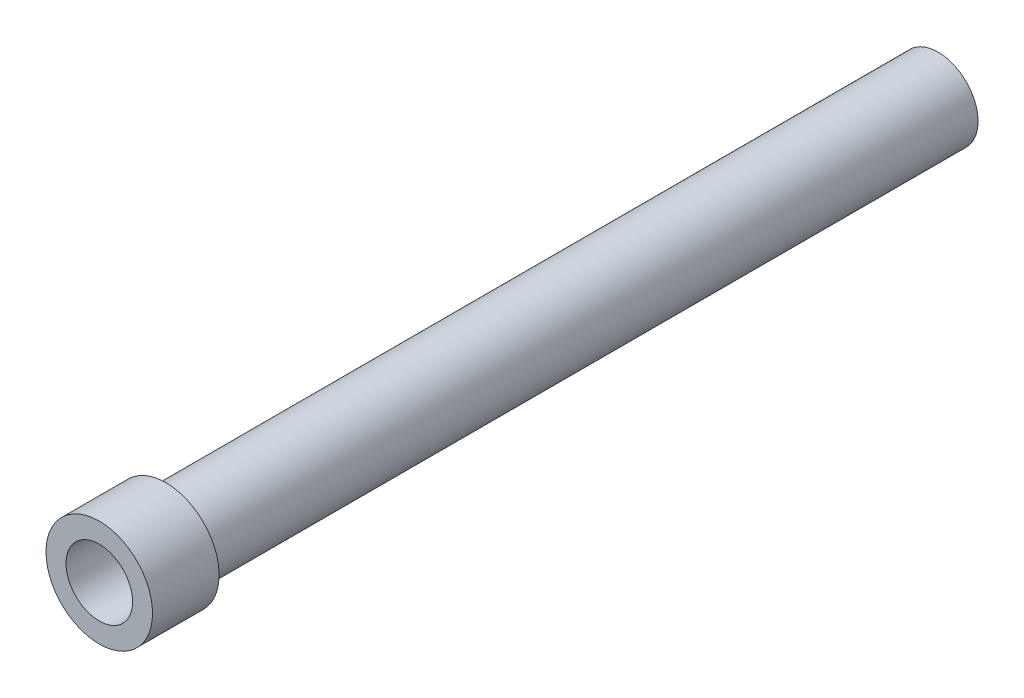
ISO-10303-21;
HEADER;
FILE_DESCRIPTION(('STEP AP214'),'2;1');
FILE_NAME('part.step','',(''),(''),'','','');
FILE_SCHEMA(('AUTOMOTIVE_DESIGN { 1 0 10303 214 1 1 1 1 }'));
ENDSEC;
DATA;
#1=APPLICATION_CONTEXT('core data for automotive mechanical design processes');
#2=APPLICATION_PROTOCOL_DEFINITION('international standard','automotive_design',2000,#1);
#3=PRODUCT_CONTEXT('',#1,'mechanical');
#4=PRODUCT('Part','Part','',(#3));
#5=PRODUCT_RELATED_PRODUCT_CATEGORY('part','',(#4));
#6=PRODUCT_DEFINITION_FORMATION('','',#4);
#7=PRODUCT_DEFINITION_CONTEXT('part definition',#1,'design');
#8=PRODUCT_DEFINITION('design','',#6,#7);
#9=PRODUCT_DEFINITION_SHAPE('','',#8);
#10=(LENGTH_UNIT() NAMED_UNIT(*) SI_UNIT(.MILLI.,.METRE.));
#11=(NAMED_UNIT(*) PLANE_ANGLE_UNIT() SI_UNIT($,.RADIAN.));
#12=(NAMED_UNIT(*) SI_UNIT($,.STERADIAN.) SOLID_ANGLE_UNIT());
#13=UNCERTAINTY_MEASURE_WITH_UNIT(LENGTH_MEASURE(1.E-05),#10,'distance_accuracy_value','');
#14=(GEOMETRIC_REPRESENTATION_CONTEXT(3) GLOBAL_UNCERTAINTY_ASSIGNED_CONTEXT((#13)) GLOBAL_UNIT_ASSIGNED_CONTEXT((#10,
#11,#12)) REPRESENTATION_CONTEXT('',''));
#15=CARTESIAN_POINT('',(0.,0.,0.));
#16=DIRECTION('',(0.,0.,1.));
#17=DIRECTION('',(1.,0.,0.));
#18=AXIS2_PLACEMENT_3D('',#15,#16,#17);
#19=CARTESIAN_POINT('',(-21.2024389130223,3.95852329038651,63.));
#20=DIRECTION('',(0.,0.,-1.));
#21=DIRECTION('',(-1.,0.,0.));
#22=AXIS2_PLACEMENT_3D('',#19,#20,#21);
#23=CYLINDRICAL_SURFACE('',#22,4.);
#24=CARTESIAN_POINT('',(-21.2024389130223,3.95852329038651,63.));
#25=DIRECTION('',(0.,0.,1.));
#26=DIRECTION('',(1.,0.,0.));
#27=AXIS2_PLACEMENT_3D('',#24,#25,#26);
#28=CIRCLE('',#27,4.);
#29=CARTESIAN_POINT('',(-17.2024389130223,3.95852329038651,63.));
#30=VERTEX_POINT('',#29);
#31=EDGE_CURVE('E10',#30,#30,#28,.T.);
#32=ORIENTED_EDGE('',*,*,#31,.F.);
#33=EDGE_LOOP('',(#32));
#34=FACE_BOUND('',#33,.T.);
#35=CARTESIAN_POINT('',(-21.2024389130223,3.95852329038651,58.));
#36=DIRECTION('',(0.,0.,-1.));
#37=DIRECTION('',(-1.,0.,0.));
#38=AXIS2_PLACEMENT_3D('',#35,#36,#37);
#39=CIRCLE('',#38,4.);
#40=CARTESIAN_POINT('',(-25.2024389130223,3.95852329038651,58.));
#41=VERTEX_POINT('',#40);
#42=EDGE_CURVE('E35',#41,#41,#39,.T.);
#43=ORIENTED_EDGE('',*,*,#42,.F.);
#44=EDGE_LOOP('',(#43));
#45=FACE_BOUND('',#44,.T.);
#46=ADVANCED_FACE('F32',(#34,#45),#23,.T.);
#47=CARTESIAN_POINT('',(-21.2024389130223,3.95852329038651,63.));
#48=DIRECTION('',(0.,0.,1.));
#49=DIRECTION('',(1.,0.,0.));
#50=AXIS2_PLACEMENT_3D('',#47,#48,#49);
#51=PLANE('',#50);
#52=CARTESIAN_POINT('',(-21.2024389130223,3.95852329038651,63.));
#53=DIRECTION('',(0.,0.,1.));
#54=DIRECTION('',(1.,0.,0.));
#55=AXIS2_PLACEMENT_3D('',#52,#53,#54);
#56=CIRCLE('',#55,2.5);
#57=CARTESIAN_POINT('',(-18.7024389130223,3.95852329038651,63.));
#58=VERTEX_POINT('',#57);
#59=EDGE_CURVE('E43',#58,#58,#56,.T.);
#60=ORIENTED_EDGE('',*,*,#59,.F.);
#61=EDGE_LOOP('',(#60));
#62=FACE_BOUND('',#61,.T.);
#63=ORIENTED_EDGE('',*,*,#31,.T.);
#64=EDGE_LOOP('',(#63));
#65=FACE_BOUND('',#64,.T.);
#66=ADVANCED_FACE('F61',(#62,#65),#51,.T.);
#67=CARTESIAN_POINT('',(-21.2024389130223,3.95852329038651,36.));
#68=DIRECTION('',(0.,0.,1.));
#69=DIRECTION('',(1.,0.,0.));
#70=AXIS2_PLACEMENT_3D('',#67,#68,#69);
#71=CYLINDRICAL_SURFACE('',#70,2.5);
#72=CARTESIAN_POINT('',(-21.2024389130223,3.95852329038651,36.));
#73=DIRECTION('',(0.,0.,1.));
#74=DIRECTION('',(1.,0.,0.));
#75=AXIS2_PLACEMENT_3D('',#72,#73,#74);
#76=CIRCLE('',#75,2.5);
#77=CARTESIAN_POINT('',(-18.7024389130223,3.95852329038651,36.));
#78=VERTEX_POINT('',#77);
#79=EDGE_CURVE('E39',#78,#78,#76,.T.);
#80=ORIENTED_EDGE('',*,*,#79,.F.);
#81=EDGE_LOOP('',(#80));
#82=FACE_BOUND('',#81,.T.);
#83=ORIENTED_EDGE('',*,*,#59,.T.);
#84=EDGE_LOOP('',(#83));
#85=FACE_BOUND('',#84,.T.);
#86=ADVANCED_FACE('F66',(#82,#85),#71,.F.);
#87=CARTESIAN_POINT('',(-21.2024389130223,3.95852329038651,36.));
#88=DIRECTION('',(0.,0.,1.));
#89=DIRECTION('',(1.,0.,0.));
#90=AXIS2_PLACEMENT_3D('',#87,#88,#89);
#91=PLANE('',#90);
#92=ORIENTED_EDGE('',*,*,#79,.T.);
#93=EDGE_LOOP('',(#92));
#94=FACE_BOUND('',#93,.T.);
#95=ADVANCED_FACE('F72',(#94),#91,.T.);
#96=CARTESIAN_POINT('',(-21.2024389130223,3.95852329038651,58.));
#97=DIRECTION('',(0.,0.,-1.));
#98=DIRECTION('',(-1.,0.,0.));
#99=AXIS2_PLACEMENT_3D('',#96,#97,#98);
#100=PLANE('',#99);
#101=CARTESIAN_POINT('',(-21.2024389130223,3.95852329038651,58.));
#102=DIRECTION('',(0.,0.,-1.));
#103=DIRECTION('',(-1.,0.,0.));
#104=AXIS2_PLACEMENT_3D('',#101,#102,#103);
#105=CIRCLE('',#104,3.);
#106=CARTESIAN_POINT('',(-24.2024389130223,3.95852329038651,58.));
#107=VERTEX_POINT('',#106);
#108=EDGE_CURVE('E51',#107,#107,#105,.T.);
#109=ORIENTED_EDGE('',*,*,#108,.F.);
#110=EDGE_LOOP('',(#109));
#111=FACE_BOUND('',#110,.T.);
#112=ORIENTED_EDGE('',*,*,#42,.T.);
#113=EDGE_LOOP('',(#112));
#114=FACE_BOUND('',#113,.T.);
#115=ADVANCED_FACE('F58',(#111,#114),#100,.T.);
#116=CARTESIAN_POINT('',(-21.2024389130223,3.95852329038651,58.));
#117=DIRECTION('',(0.,0.,-1.));
#118=DIRECTION('',(-1.,0.,0.));
#119=AXIS2_PLACEMENT_3D('',#116,#117,#118);
#120=CYLINDRICAL_SURFACE('',#119,3.);
#121=CARTESIAN_POINT('',(-21.2024389130223,3.95852329038651,0.));
#122=DIRECTION('',(0.,0.,-1.));
#123=DIRECTION('',(-1.,0.,0.));
#124=AXIS2_PLACEMENT_3D('',#121,#122,#123);
#125=CIRCLE('',#124,3.);
#126=CARTESIAN_POINT('',(-24.2024389130223,3.95852329038651,0.));
#127=VERTEX_POINT('',#126);
#128=EDGE_CURVE('E48',#127,#127,#125,.T.);
#129=CARTESIAN_POINT('',(-24.2024389130223,3.95852329038651,58.));
#130=CARTESIAN_POINT('',(-24.2024389130223,3.95852329038651,57.3958333333333));
#131=CARTESIAN_POINT('',(-24.2024389130223,3.95852329038651,56.7916666666667));
#132=CARTESIAN_POINT('',(-24.2024389130223,3.95852329038651,55.5833333333333));
#133=CARTESIAN_POINT('',(-24.2024389130223,3.95852329038651,54.9791666666667));
#134=CARTESIAN_POINT('',(-24.2024389130223,3.95852329038651,53.7708333333333));
#135=CARTESIAN_POINT('',(-24.2024389130223,3.95852329038651,53.1666666666667));
#136=CARTESIAN_POINT('',(-24.2024389130223,3.95852329038651,51.9583333333333));
#137=CARTESIAN_POINT('',(-24.2024389130223,3.95852329038651,51.3541666666667));
#138=CARTESIAN_POINT('',(-24.2024389130223,3.95852329038651,50.1458333333333));
#139=CARTESIAN_POINT('',(-24.2024389130223,3.95852329038651,49.5416666666667));
#140=CARTESIAN_POINT('',(-24.2024389130223,3.95852329038651,48.3333333333333));
#141=CARTESIAN_POINT('',(-24.2024389130223,3.95852329038651,47.7291666666667));
#142=CARTESIAN_POINT('',(-24.2024389130223,3.95852329038651,46.5208333333333));
#143=CARTESIAN_POINT('',(-24.2024389130223,3.95852329038651,45.9166666666667));
#144=CARTESIAN_POINT('',(-24.2024389130223,3.95852329038651,44.7083333333333));
#145=CARTESIAN_POINT('',(-24.2024389130223,3.95852329038651,44.1041666666667));
#146=CARTESIAN_POINT('',(-24.2024389130223,3.95852329038651,42.8958333333333));
#147=CARTESIAN_POINT('',(-24.2024389130223,3.95852329038651,42.2916666666667));
#148=CARTESIAN_POINT('',(-24.2024389130223,3.95852329038651,41.0833333333333));
#149=CARTESIAN_POINT('',(-24.2024389130223,3.95852329038651,40.4791666666667));
#150=CARTESIAN_POINT('',(-24.2024389130223,3.95852329038651,39.2708333333333));
#151=CARTESIAN_POINT('',(-24.2024389130223,3.95852329038651,38.6666666666667));
#152=CARTESIAN_POINT('',(-24.2024389130223,3.95852329038651,37.4583333333333));
#153=CARTESIAN_POINT('',(-24.2024389130223,3.95852329038651,36.8541666666667));
#154=CARTESIAN_POINT('',(-24.2024389130223,3.95852329038651,35.6458333333333));
#155=CARTESIAN_POINT('',(-24.2024389130223,3.95852329038651,35.0416666666667));
#156=CARTESIAN_POINT('',(-24.2024389130223,3.95852329038651,33.8333333333333));
#157=CARTESIAN_POINT('',(-24.2024389130223,3.95852329038651,33.2291666666667));
#158=CARTESIAN_POINT('',(-24.2024389130223,3.95852329038651,32.0208333333333));
#159=CARTESIAN_POINT('',(-24.2024389130223,3.95852329038651,31.4166666666667));
#160=CARTESIAN_POINT('',(-24.2024389130223,3.95852329038651,30.2083333333333));
#161=CARTESIAN_POINT('',(-24.2024389130223,3.95852329038651,29.6041666666667));
#162=CARTESIAN_POINT('',(-24.2024389130223,3.95852329038651,28.3958333333333));
#163=CARTESIAN_POINT('',(-24.2024389130223,3.95852329038651,27.7916666666667));
#164=CARTESIAN_POINT('',(-24.2024389130223,3.95852329038651,26.5833333333333));
#165=CARTESIAN_POINT('',(-24.2024389130223,3.95852329038651,25.9791666666667));
#166=CARTESIAN_POINT('',(-24.2024389130223,3.95852329038651,24.7708333333333));
#167=CARTESIAN_POINT('',(-24.2024389130223,3.95852329038651,24.1666666666667));
#168=CARTESIAN_POINT('',(-24.2024389130223,3.95852329038651,22.9583333333333));
#169=CARTESIAN_POINT('',(-24.2024389130223,3.95852329038651,22.3541666666667));
#170=CARTESIAN_POINT('',(-24.2024389130223,3.95852329038651,21.1458333333333));
#171=CARTESIAN_POINT('',(-24.2024389130223,3.95852329038651,20.5416666666667));
#172=CARTESIAN_POINT('',(-24.2024389130223,3.95852329038651,19.3333333333333));
#173=CARTESIAN_POINT('',(-24.2024389130223,3.95852329038651,18.7291666666667));
#174=CARTESIAN_POINT('',(-24.2024389130223,3.95852329038651,17.5208333333333));
#175=CARTESIAN_POINT('',(-24.2024389130223,3.95852329038651,16.9166666666667));
#176=CARTESIAN_POINT('',(-24.2024389130223,3.95852329038651,15.7083333333333));
#177=CARTESIAN_POINT('',(-24.2024389130223,3.95852329038651,15.1041666666667));
#178=CARTESIAN_POINT('',(-24.2024389130223,3.95852329038651,13.8958333333333));
#179=CARTESIAN_POINT('',(-24.2024389130223,3.95852329038651,13.2916666666667));
#180=CARTESIAN_POINT('',(-24.2024389130223,3.95852329038651,12.0833333333333));
#181=CARTESIAN_POINT('',(-24.2024389130223,3.95852329038651,11.4791666666667));
#182=CARTESIAN_POINT('',(-24.2024389130223,3.95852329038651,10.2708333333333));
#183=CARTESIAN_POINT('',(-24.2024389130223,3.95852329038651,9.66666666666667));
#184=CARTESIAN_POINT('',(-24.2024389130223,3.95852329038651,8.45833333333333));
#185=CARTESIAN_POINT('',(-24.2024389130223,3.95852329038651,7.85416666666667));
#186=CARTESIAN_POINT('',(-24.2024389130223,3.95852329038651,6.64583333333333));
#187=CARTESIAN_POINT('',(-24.2024389130223,3.95852329038651,6.04166666666667));
#188=CARTESIAN_POINT('',(-24.2024389130223,3.95852329038651,4.83333333333333));
#189=CARTESIAN_POINT('',(-24.2024389130223,3.95852329038651,4.22916666666667));
#190=CARTESIAN_POINT('',(-24.2024389130223,3.95852329038651,3.02083333333334));
#191=CARTESIAN_POINT('',(-24.2024389130223,3.95852329038651,2.41666666666667));
#192=CARTESIAN_POINT('',(-24.2024389130223,3.95852329038651,1.20833333333333));
#193=CARTESIAN_POINT('',(-24.2024389130223,3.95852329038651,0.604166666666666));
#194=CARTESIAN_POINT('',(-24.2024389130223,3.95852329038651,0.));
#195=B_SPLINE_CURVE_WITH_KNOTS('',3,(#129,#130,#131,#132,#133,#134,#135,#136,#137,#138,#139,
#140,#141,#142,#143,#144,#145,#146,#147,#148,#149,#150,#151,#152,#153,#154,#155,#156,#157,#158,
#159,#160,#161,#162,#163,#164,#165,#166,#167,#168,#169,#170,#171,#172,#173,#174,#175,#176,#177,
#178,#179,#180,#181,#182,#183,#184,#185,#186,#187,#188,#189,#190,#191,#192,#193,#194),
.UNSPECIFIED.,.F.,.F.,(4,2,2,2,2,2,2,2,2,2,2,2,2,2,2,2,2,2,2,2,2,2,2,2,2,2,2,2,2,2,2,2,4),(0.,
1.81249999999999,3.625,5.4375,7.25,9.06249999999999,10.875,12.6875,14.5,16.3125,18.125,19.9375,
21.75,23.5625,25.375,27.1875,29.,30.8125,32.625,34.4375,36.25,38.0625,39.875,41.6875,43.5,
45.3125,47.125,48.9375,50.75,52.5625,54.375,56.1875,58.),.UNSPECIFIED.);
#196=EDGE_CURVE('BSEAM79',#107,#127,#195,.T.);
#197=ORIENTED_EDGE('',*,*,#108,.T.);
#198=ORIENTED_EDGE('',*,*,#128,.F.);
#199=ORIENTED_EDGE('',*,*,#196,.T.);
#200=ORIENTED_EDGE('',*,*,#196,.F.);
#201=EDGE_LOOP('',(#197,#199,#198,#200));
#202=FACE_BOUND('',#201,.T.);
#203=ADVANCED_FACE('F79',(#202),#120,.T.);
#204=CARTESIAN_POINT('',(-21.2024389130223,3.95852329038651,0.));
#205=DIRECTION('',(0.,0.,1.));
#206=DIRECTION('',(1.,0.,0.));
#207=AXIS2_PLACEMENT_3D('',#204,#205,#206);
#208=PLANE('',#207);
#209=ORIENTED_EDGE('',*,*,#128,.T.);
#210=EDGE_LOOP('',(#209));
#211=FACE_BOUND('',#210,.T.);
#212=ADVANCED_FACE('F77',(#211),#208,.F.);
#213=CLOSED_SHELL('',(#46,#66,#86,#95,#115,#203,#212));
#214=MANIFOLD_SOLID_BREP('B2',#213);
#215=ADVANCED_BREP_SHAPE_REPRESENTATION('',(#18,#214),#14);
#216=SHAPE_DEFINITION_REPRESENTATION(#9,#215);
ENDSEC;
END-ISO-10303-21;
